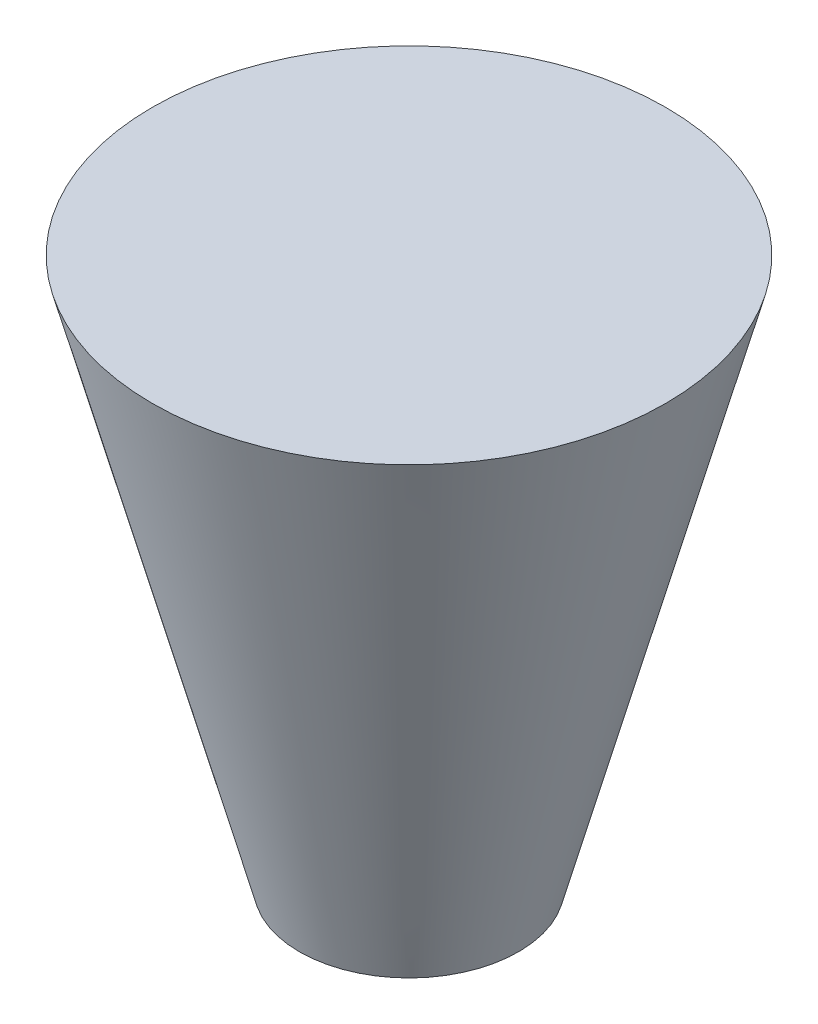
ISO-10303-21;
HEADER;
FILE_DESCRIPTION(('STEP AP214'),'2;1');
FILE_NAME('part.step','',(''),(''),'','','');
FILE_SCHEMA(('AUTOMOTIVE_DESIGN { 1 0 10303 214 1 1 1 1 }'));
ENDSEC;
DATA;
#1=APPLICATION_CONTEXT('core data for automotive mechanical design processes');
#2=APPLICATION_PROTOCOL_DEFINITION('international standard','automotive_design',2000,#1);
#3=PRODUCT_CONTEXT('',#1,'mechanical');
#4=PRODUCT('Part','Part','',(#3));
#5=PRODUCT_RELATED_PRODUCT_CATEGORY('part','',(#4));
#6=PRODUCT_DEFINITION_FORMATION('','',#4);
#7=PRODUCT_DEFINITION_CONTEXT('part definition',#1,'design');
#8=PRODUCT_DEFINITION('design','',#6,#7);
#9=PRODUCT_DEFINITION_SHAPE('','',#8);
#10=(LENGTH_UNIT() NAMED_UNIT(*) SI_UNIT(.MILLI.,.METRE.));
#11=(NAMED_UNIT(*) PLANE_ANGLE_UNIT() SI_UNIT($,.RADIAN.));
#12=(NAMED_UNIT(*) SI_UNIT($,.STERADIAN.) SOLID_ANGLE_UNIT());
#13=UNCERTAINTY_MEASURE_WITH_UNIT(LENGTH_MEASURE(1.E-05),#10,'distance_accuracy_value','');
#14=(GEOMETRIC_REPRESENTATION_CONTEXT(3) GLOBAL_UNCERTAINTY_ASSIGNED_CONTEXT((#13)) GLOBAL_UNIT_ASSIGNED_CONTEXT((#10,
#11,#12)) REPRESENTATION_CONTEXT('',''));
#15=CARTESIAN_POINT('',(0.,0.,0.));
#16=DIRECTION('',(0.,0.,1.));
#17=DIRECTION('',(1.,0.,0.));
#18=AXIS2_PLACEMENT_3D('',#15,#16,#17);
#19=CARTESIAN_POINT('',(0.,0.,0.));
#20=DIRECTION('',(0.,1.,0.));
#21=DIRECTION('',(0.,0.,1.));
#22=AXIS2_PLACEMENT_3D('',#19,#20,#21);
#23=CONICAL_SURFACE('',#22,10.,0.26179938779915);
#24=CARTESIAN_POINT('',(0.,50.,0.));
#25=DIRECTION('',(0.,1.,0.));
#26=DIRECTION('',(0.,0.,1.));
#27=AXIS2_PLACEMENT_3D('',#24,#25,#26);
#28=CIRCLE('',#27,23.3974596215562);
#29=CARTESIAN_POINT('',(0.,50.,23.3974596215562));
#30=VERTEX_POINT('',#29);
#31=EDGE_CURVE('E10',#30,#30,#28,.T.);
#32=ORIENTED_EDGE('',*,*,#31,.F.);
#33=EDGE_LOOP('',(#32));
#34=FACE_BOUND('',#33,.T.);
#35=CARTESIAN_POINT('',(0.,0.,0.));
#36=DIRECTION('',(0.,1.,0.));
#37=DIRECTION('',(0.,0.,1.));
#38=AXIS2_PLACEMENT_3D('',#35,#36,#37);
#39=CIRCLE('',#38,10.);
#40=CARTESIAN_POINT('',(0.,0.,10.));
#41=VERTEX_POINT('',#40);
#42=EDGE_CURVE('E44',#41,#41,#39,.T.);
#43=ORIENTED_EDGE('',*,*,#42,.T.);
#44=EDGE_LOOP('',(#43));
#45=FACE_BOUND('',#44,.T.);
#46=ADVANCED_FACE('F37',(#34,#45),#23,.T.);
#47=CARTESIAN_POINT('',(0.,50.,0.));
#48=DIRECTION('',(0.,1.,0.));
#49=DIRECTION('',(0.,0.,1.));
#50=AXIS2_PLACEMENT_3D('',#47,#48,#49);
#51=PLANE('',#50);
#52=ORIENTED_EDGE('',*,*,#31,.T.);
#53=EDGE_LOOP('',(#52));
#54=FACE_BOUND('',#53,.T.);
#55=ADVANCED_FACE('F54',(#54),#51,.T.);
#56=CARTESIAN_POINT('',(0.,0.,0.));
#57=DIRECTION('',(0.,1.,0.));
#58=DIRECTION('',(0.,0.,1.));
#59=AXIS2_PLACEMENT_3D('',#56,#57,#58);
#60=PLANE('',#59);
#61=ORIENTED_EDGE('',*,*,#42,.F.);
#62=EDGE_LOOP('',(#61));
#63=FACE_BOUND('',#62,.T.);
#64=ADVANCED_FACE('F52',(#63),#60,.F.);
#65=CLOSED_SHELL('',(#46,#55,#64));
#66=MANIFOLD_SOLID_BREP('B2',#65);
#67=ADVANCED_BREP_SHAPE_REPRESENTATION('',(#18,#66),#14);
#68=SHAPE_DEFINITION_REPRESENTATION(#9,#67);
ENDSEC;
END-ISO-10303-21;
